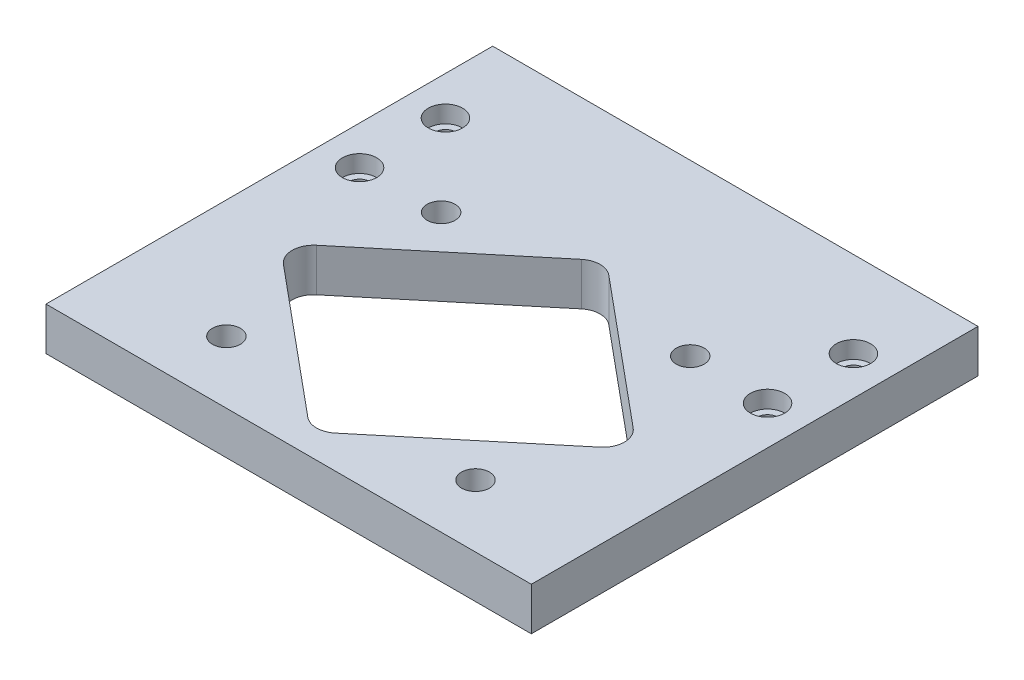
ISO-10303-21;
HEADER;
FILE_DESCRIPTION(('STEP AP214'),'2;1');
FILE_NAME('part.step','',(''),(''),'','','');
FILE_SCHEMA(('AUTOMOTIVE_DESIGN { 1 0 10303 214 1 1 1 1 }'));
ENDSEC;
DATA;
#1=APPLICATION_CONTEXT('core data for automotive mechanical design processes');
#2=APPLICATION_PROTOCOL_DEFINITION('international standard','automotive_design',2000,#1);
#3=PRODUCT_CONTEXT('',#1,'mechanical');
#4=PRODUCT('Part','Part','',(#3));
#5=PRODUCT_RELATED_PRODUCT_CATEGORY('part','',(#4));
#6=PRODUCT_DEFINITION_FORMATION('','',#4);
#7=PRODUCT_DEFINITION_CONTEXT('part definition',#1,'design');
#8=PRODUCT_DEFINITION('design','',#6,#7);
#9=PRODUCT_DEFINITION_SHAPE('','',#8);
#10=(LENGTH_UNIT() NAMED_UNIT(*) SI_UNIT(.MILLI.,.METRE.));
#11=(NAMED_UNIT(*) PLANE_ANGLE_UNIT() SI_UNIT($,.RADIAN.));
#12=(NAMED_UNIT(*) SI_UNIT($,.STERADIAN.) SOLID_ANGLE_UNIT());
#13=UNCERTAINTY_MEASURE_WITH_UNIT(LENGTH_MEASURE(1.E-05),#10,'distance_accuracy_value','');
#14=(GEOMETRIC_REPRESENTATION_CONTEXT(3) GLOBAL_UNCERTAINTY_ASSIGNED_CONTEXT((#13)) GLOBAL_UNIT_ASSIGNED_CONTEXT((#10,
#11,#12)) REPRESENTATION_CONTEXT('',''));
#15=CARTESIAN_POINT('',(0.,0.,0.));
#16=DIRECTION('',(0.,0.,1.));
#17=DIRECTION('',(1.,0.,0.));
#18=AXIS2_PLACEMENT_3D('',#15,#16,#17);
#19=CARTESIAN_POINT('',(0.,10.,0.));
#20=DIRECTION('',(0.,-1.,0.));
#21=DIRECTION('',(0.,0.,-1.));
#22=AXIS2_PLACEMENT_3D('',#19,#20,#21);
#23=PLANE('',#22);
#24=CARTESIAN_POINT('',(-47.5,10.,-44.5));
#25=DIRECTION('',(0.,1.,0.));
#26=DIRECTION('',(0.,0.,1.));
#27=AXIS2_PLACEMENT_3D('',#24,#25,#26);
#28=CIRCLE('',#27,4.);
#29=CARTESIAN_POINT('',(-47.5,10.,-40.5));
#30=VERTEX_POINT('',#29);
#31=EDGE_CURVE('E419',#30,#30,#28,.T.);
#32=ORIENTED_EDGE('',*,*,#31,.F.);
#33=EDGE_LOOP('',(#32));
#34=FACE_BOUND('',#33,.T.);
#35=DIRECTION('',(-0.768980150656052,0.,0.639272655364669));
#36=VECTOR('',#35,1.);
#37=CARTESIAN_POINT('',(0.,10.,-34.5));
#38=LINE('',#37,#36);
#39=CARTESIAN_POINT('',(-3.19636327682333,10.,-31.8427823361348));
#40=VERTEX_POINT('',#39);
#41=CARTESIAN_POINT('',(-36.8749744561991,10.,-3.84490075328026));
#42=VERTEX_POINT('',#41);
#43=EDGE_CURVE('E224',#40,#42,#38,.T.);
#44=ORIENTED_EDGE('',*,*,#43,.F.);
#45=CARTESIAN_POINT('',(0.,10.,-27.9978815828545));
#46=DIRECTION('',(0.,-1.,0.));
#47=DIRECTION('',(0.,0.,-1.));
#48=AXIS2_PLACEMENT_3D('',#45,#46,#47);
#49=CIRCLE('',#48,5.);
#50=CARTESIAN_POINT('',(3.19636327682336,10.,-31.8427823361348));
#51=VERTEX_POINT('',#50);
#52=EDGE_CURVE('E190',#40,#51,#49,.T.);
#53=ORIENTED_EDGE('',*,*,#52,.T.);
#54=DIRECTION('',(-0.768980150656052,0.,-0.639272655364669));
#55=VECTOR('',#54,1.);
#56=CARTESIAN_POINT('',(0.,10.,-34.5));
#57=LINE('',#56,#55);
#58=CARTESIAN_POINT('',(36.8749744561991,10.,-3.84490075328027));
#59=VERTEX_POINT('',#58);
#60=EDGE_CURVE('E242',#59,#51,#57,.T.);
#61=ORIENTED_EDGE('',*,*,#60,.F.);
#62=CARTESIAN_POINT('',(33.6786111793758,10.,0.));
#63=DIRECTION('',(0.,-1.,0.));
#64=DIRECTION('',(0.,0.,-1.));
#65=AXIS2_PLACEMENT_3D('',#62,#63,#64);
#66=CIRCLE('',#65,5.);
#67=CARTESIAN_POINT('',(36.8749744561991,10.,3.84490075328027));
#68=VERTEX_POINT('',#67);
#69=EDGE_CURVE('E202',#59,#68,#66,.T.);
#70=ORIENTED_EDGE('',*,*,#69,.T.);
#71=DIRECTION('',(0.768980150656052,0.,-0.639272655364669));
#72=VECTOR('',#71,1.);
#73=CARTESIAN_POINT('',(41.5,10.,0.));
#74=LINE('',#73,#72);
#75=CARTESIAN_POINT('',(3.19636327682335,10.,31.8427823361348));
#76=VERTEX_POINT('',#75);
#77=EDGE_CURVE('E215',#76,#68,#74,.T.);
#78=ORIENTED_EDGE('',*,*,#77,.F.);
#79=CARTESIAN_POINT('',(0.,10.,27.9978815828545));
#80=DIRECTION('',(0.,-1.,0.));
#81=DIRECTION('',(0.,0.,-1.));
#82=AXIS2_PLACEMENT_3D('',#79,#80,#81);
#83=CIRCLE('',#82,5.);
#84=CARTESIAN_POINT('',(-3.19636327682336,10.,31.8427823361348));
#85=VERTEX_POINT('',#84);
#86=EDGE_CURVE('E48',#76,#85,#83,.T.);
#87=ORIENTED_EDGE('',*,*,#86,.T.);
#88=DIRECTION('',(0.768980150656052,0.,0.639272655364669));
#89=VECTOR('',#88,1.);
#90=CARTESIAN_POINT('',(-41.5,10.,0.));
#91=LINE('',#90,#89);
#92=CARTESIAN_POINT('',(-36.8749744561991,10.,3.84490075328026));
#93=VERTEX_POINT('',#92);
#94=EDGE_CURVE('E214',#93,#85,#91,.T.);
#95=ORIENTED_EDGE('',*,*,#94,.F.);
#96=CARTESIAN_POINT('',(-33.6786111793758,10.,0.));
#97=DIRECTION('',(0.,-1.,0.));
#98=DIRECTION('',(0.,0.,-1.));
#99=AXIS2_PLACEMENT_3D('',#96,#97,#98);
#100=CIRCLE('',#99,5.);
#101=EDGE_CURVE('E196',#93,#42,#100,.T.);
#102=ORIENTED_EDGE('',*,*,#101,.T.);
#103=EDGE_LOOP('',(#44,#53,#61,#70,#78,#87,#95,#102));
#104=FACE_BOUND('',#103,.T.);
#105=CARTESIAN_POINT('',(29.,10.,25.));
#106=DIRECTION('',(0.,-1.,0.));
#107=DIRECTION('',(0.,0.,-1.));
#108=AXIS2_PLACEMENT_3D('',#105,#106,#107);
#109=CIRCLE('',#108,3.25);
#110=CARTESIAN_POINT('',(29.,10.,21.75));
#111=VERTEX_POINT('',#110);
#112=EDGE_CURVE('E236',#111,#111,#109,.T.);
#113=ORIENTED_EDGE('',*,*,#112,.T.);
#114=EDGE_LOOP('',(#113));
#115=FACE_BOUND('',#114,.T.);
#116=CARTESIAN_POINT('',(29.,10.,-25.));
#117=DIRECTION('',(0.,-1.,0.));
#118=DIRECTION('',(0.,0.,-1.));
#119=AXIS2_PLACEMENT_3D('',#116,#117,#118);
#120=CIRCLE('',#119,3.25);
#121=CARTESIAN_POINT('',(29.,10.,-28.25));
#122=VERTEX_POINT('',#121);
#123=EDGE_CURVE('E262',#122,#122,#120,.T.);
#124=ORIENTED_EDGE('',*,*,#123,.T.);
#125=EDGE_LOOP('',(#124));
#126=FACE_BOUND('',#125,.T.);
#127=CARTESIAN_POINT('',(-29.,10.,-25.));
#128=DIRECTION('',(0.,-1.,0.));
#129=DIRECTION('',(0.,0.,-1.));
#130=AXIS2_PLACEMENT_3D('',#127,#128,#129);
#131=CIRCLE('',#130,3.25);
#132=CARTESIAN_POINT('',(-29.,10.,-28.25));
#133=VERTEX_POINT('',#132);
#134=EDGE_CURVE('E253',#133,#133,#131,.T.);
#135=ORIENTED_EDGE('',*,*,#134,.T.);
#136=EDGE_LOOP('',(#135));
#137=FACE_BOUND('',#136,.T.);
#138=CARTESIAN_POINT('',(-29.,10.,25.));
#139=DIRECTION('',(0.,-1.,0.));
#140=DIRECTION('',(0.,0.,-1.));
#141=AXIS2_PLACEMENT_3D('',#138,#139,#140);
#142=CIRCLE('',#141,3.25);
#143=CARTESIAN_POINT('',(-29.,10.,21.75));
#144=VERTEX_POINT('',#143);
#145=EDGE_CURVE('E273',#144,#144,#142,.T.);
#146=ORIENTED_EDGE('',*,*,#145,.T.);
#147=EDGE_LOOP('',(#146));
#148=FACE_BOUND('',#147,.T.);
#149=DIRECTION('',(0.,0.,-1.));
#150=VECTOR('',#149,1.);
#151=CARTESIAN_POINT('',(56.5,10.,39.5));
#152=LINE('',#151,#150);
#153=CARTESIAN_POINT('',(56.5,10.,39.5));
#154=VERTEX_POINT('',#153);
#155=CARTESIAN_POINT('',(56.5,10.,-64.5));
#156=VERTEX_POINT('',#155);
#157=EDGE_CURVE('E141',#154,#156,#152,.T.);
#158=ORIENTED_EDGE('',*,*,#157,.T.);
#159=DIRECTION('',(-1.,0.,0.));
#160=VECTOR('',#159,1.);
#161=CARTESIAN_POINT('',(-56.5,10.,-64.5));
#162=LINE('',#161,#160);
#163=CARTESIAN_POINT('',(-56.5,10.,-64.5));
#164=VERTEX_POINT('',#163);
#165=EDGE_CURVE('E129',#156,#164,#162,.T.);
#166=ORIENTED_EDGE('',*,*,#165,.T.);
#167=DIRECTION('',(0.,0.,1.));
#168=VECTOR('',#167,1.);
#169=CARTESIAN_POINT('',(-56.5,10.,39.5));
#170=LINE('',#169,#168);
#171=CARTESIAN_POINT('',(-56.5,10.,39.5));
#172=VERTEX_POINT('',#171);
#173=EDGE_CURVE('E140',#164,#172,#170,.T.);
#174=ORIENTED_EDGE('',*,*,#173,.T.);
#175=DIRECTION('',(1.,0.,0.));
#176=VECTOR('',#175,1.);
#177=CARTESIAN_POINT('',(-56.5,10.,39.5));
#178=LINE('',#177,#176);
#179=EDGE_CURVE('E146',#172,#154,#178,.T.);
#180=ORIENTED_EDGE('',*,*,#179,.T.);
#181=EDGE_LOOP('',(#158,#166,#174,#180));
#182=FACE_BOUND('',#181,.T.);
#183=CARTESIAN_POINT('',(-47.5,10.,-24.5));
#184=DIRECTION('',(0.,1.,0.));
#185=DIRECTION('',(0.,0.,1.));
#186=AXIS2_PLACEMENT_3D('',#183,#184,#185);
#187=CIRCLE('',#186,3.99999999999999);
#188=CARTESIAN_POINT('',(-47.5,10.,-20.5));
#189=VERTEX_POINT('',#188);
#190=EDGE_CURVE('E433',#189,#189,#187,.T.);
#191=ORIENTED_EDGE('',*,*,#190,.F.);
#192=EDGE_LOOP('',(#191));
#193=FACE_BOUND('',#192,.T.);
#194=CARTESIAN_POINT('',(47.5,10.,-24.5));
#195=DIRECTION('',(0.,1.,0.));
#196=DIRECTION('',(0.,0.,1.));
#197=AXIS2_PLACEMENT_3D('',#194,#195,#196);
#198=CIRCLE('',#197,3.99999999999999);
#199=CARTESIAN_POINT('',(47.5,10.,-20.5));
#200=VERTEX_POINT('',#199);
#201=EDGE_CURVE('E447',#200,#200,#198,.T.);
#202=ORIENTED_EDGE('',*,*,#201,.F.);
#203=EDGE_LOOP('',(#202));
#204=FACE_BOUND('',#203,.T.);
#205=CARTESIAN_POINT('',(47.5,10.,-44.5));
#206=DIRECTION('',(0.,1.,0.));
#207=DIRECTION('',(0.,0.,1.));
#208=AXIS2_PLACEMENT_3D('',#205,#206,#207);
#209=CIRCLE('',#208,4.);
#210=CARTESIAN_POINT('',(47.5,10.,-40.5));
#211=VERTEX_POINT('',#210);
#212=EDGE_CURVE('E461',#211,#211,#209,.T.);
#213=ORIENTED_EDGE('',*,*,#212,.F.);
#214=EDGE_LOOP('',(#213));
#215=FACE_BOUND('',#214,.T.);
#216=ADVANCED_FACE('F39',(#34,#104,#115,#126,#137,#148,#182,#193,#204,#215),#23,.F.);
#217=CARTESIAN_POINT('',(56.5,10.,39.5));
#218=DIRECTION('',(-1.,0.,0.));
#219=DIRECTION('',(0.,0.,1.));
#220=AXIS2_PLACEMENT_3D('',#217,#218,#219);
#221=PLANE('',#220);
#222=DIRECTION('',(0.,0.,-1.));
#223=VECTOR('',#222,1.);
#224=CARTESIAN_POINT('',(56.5,0.,39.5));
#225=LINE('',#224,#223);
#226=CARTESIAN_POINT('',(56.5,0.,39.5));
#227=VERTEX_POINT('',#226);
#228=CARTESIAN_POINT('',(56.5,0.,-64.5));
#229=VERTEX_POINT('',#228);
#230=EDGE_CURVE('E155',#227,#229,#225,.T.);
#231=ORIENTED_EDGE('',*,*,#230,.T.);
#232=DIRECTION('',(0.,-1.,0.));
#233=VECTOR('',#232,1.);
#234=CARTESIAN_POINT('',(56.5,10.,-64.5));
#235=LINE('',#234,#233);
#236=EDGE_CURVE('E133',#156,#229,#235,.T.);
#237=ORIENTED_EDGE('',*,*,#236,.F.);
#238=ORIENTED_EDGE('',*,*,#157,.F.);
#239=DIRECTION('',(0.,-1.,0.));
#240=VECTOR('',#239,1.);
#241=CARTESIAN_POINT('',(56.5,10.,39.5));
#242=LINE('',#241,#240);
#243=EDGE_CURVE('E284',#154,#227,#242,.T.);
#244=ORIENTED_EDGE('',*,*,#243,.T.);
#245=EDGE_LOOP('',(#231,#237,#238,#244));
#246=FACE_BOUND('',#245,.T.);
#247=ADVANCED_FACE('F153',(#246),#221,.F.);
#248=CARTESIAN_POINT('',(-56.5,10.,-64.5));
#249=DIRECTION('',(0.,0.,1.));
#250=DIRECTION('',(1.,0.,0.));
#251=AXIS2_PLACEMENT_3D('',#248,#249,#250);
#252=PLANE('',#251);
#253=DIRECTION('',(-1.,0.,0.));
#254=VECTOR('',#253,1.);
#255=CARTESIAN_POINT('',(-56.5,0.,-64.5));
#256=LINE('',#255,#254);
#257=CARTESIAN_POINT('',(-56.5,0.,-64.5));
#258=VERTEX_POINT('',#257);
#259=EDGE_CURVE('E287',#229,#258,#256,.T.);
#260=ORIENTED_EDGE('',*,*,#259,.T.);
#261=DIRECTION('',(0.,-1.,0.));
#262=VECTOR('',#261,1.);
#263=CARTESIAN_POINT('',(-56.5,10.,-64.5));
#264=LINE('',#263,#262);
#265=EDGE_CURVE('E136',#164,#258,#264,.T.);
#266=ORIENTED_EDGE('',*,*,#265,.F.);
#267=ORIENTED_EDGE('',*,*,#165,.F.);
#268=ORIENTED_EDGE('',*,*,#236,.T.);
#269=EDGE_LOOP('',(#260,#266,#267,#268));
#270=FACE_BOUND('',#269,.T.);
#271=ADVANCED_FACE('F131',(#270),#252,.F.);
#272=CARTESIAN_POINT('',(-56.5,10.,39.5));
#273=DIRECTION('',(1.,0.,0.));
#274=DIRECTION('',(0.,0.,-1.));
#275=AXIS2_PLACEMENT_3D('',#272,#273,#274);
#276=PLANE('',#275);
#277=DIRECTION('',(0.,0.,1.));
#278=VECTOR('',#277,1.);
#279=CARTESIAN_POINT('',(-56.5,0.,39.5));
#280=LINE('',#279,#278);
#281=CARTESIAN_POINT('',(-56.5,0.,39.5));
#282=VERTEX_POINT('',#281);
#283=EDGE_CURVE('E290',#258,#282,#280,.T.);
#284=ORIENTED_EDGE('',*,*,#283,.T.);
#285=DIRECTION('',(0.,-1.,0.));
#286=VECTOR('',#285,1.);
#287=CARTESIAN_POINT('',(-56.5,10.,39.5));
#288=LINE('',#287,#286);
#289=EDGE_CURVE('E163',#172,#282,#288,.T.);
#290=ORIENTED_EDGE('',*,*,#289,.F.);
#291=ORIENTED_EDGE('',*,*,#173,.F.);
#292=ORIENTED_EDGE('',*,*,#265,.T.);
#293=EDGE_LOOP('',(#284,#290,#291,#292));
#294=FACE_BOUND('',#293,.T.);
#295=ADVANCED_FACE('F306',(#294),#276,.F.);
#296=CARTESIAN_POINT('',(-56.5,10.,39.5));
#297=DIRECTION('',(0.,0.,-1.));
#298=DIRECTION('',(-1.,0.,0.));
#299=AXIS2_PLACEMENT_3D('',#296,#297,#298);
#300=PLANE('',#299);
#301=DIRECTION('',(1.,0.,0.));
#302=VECTOR('',#301,1.);
#303=CARTESIAN_POINT('',(-56.5,0.,39.5));
#304=LINE('',#303,#302);
#305=EDGE_CURVE('E151',#282,#227,#304,.T.);
#306=ORIENTED_EDGE('',*,*,#305,.T.);
#307=ORIENTED_EDGE('',*,*,#243,.F.);
#308=ORIENTED_EDGE('',*,*,#179,.F.);
#309=ORIENTED_EDGE('',*,*,#289,.T.);
#310=EDGE_LOOP('',(#306,#307,#308,#309));
#311=FACE_BOUND('',#310,.T.);
#312=ADVANCED_FACE('F301',(#311),#300,.F.);
#313=CARTESIAN_POINT('',(0.,0.,0.));
#314=DIRECTION('',(0.,-1.,0.));
#315=DIRECTION('',(0.,0.,-1.));
#316=AXIS2_PLACEMENT_3D('',#313,#314,#315);
#317=PLANE('',#316);
#318=CARTESIAN_POINT('',(47.5,0.,-44.5));
#319=DIRECTION('',(0.,-1.,0.));
#320=DIRECTION('',(0.,0.,-1.));
#321=AXIS2_PLACEMENT_3D('',#318,#319,#320);
#322=CIRCLE('',#321,2.40000000000001);
#323=CARTESIAN_POINT('',(47.5,0.,-46.9));
#324=VERTEX_POINT('',#323);
#325=EDGE_CURVE('E337',#324,#324,#322,.T.);
#326=ORIENTED_EDGE('',*,*,#325,.F.);
#327=EDGE_LOOP('',(#326));
#328=FACE_BOUND('',#327,.T.);
#329=CARTESIAN_POINT('',(47.5,0.,-24.5));
#330=DIRECTION('',(0.,-1.,0.));
#331=DIRECTION('',(0.,0.,-1.));
#332=AXIS2_PLACEMENT_3D('',#329,#330,#331);
#333=CIRCLE('',#332,2.40000000000001);
#334=CARTESIAN_POINT('',(47.5,0.,-26.9));
#335=VERTEX_POINT('',#334);
#336=EDGE_CURVE('E341',#335,#335,#333,.T.);
#337=ORIENTED_EDGE('',*,*,#336,.F.);
#338=EDGE_LOOP('',(#337));
#339=FACE_BOUND('',#338,.T.);
#340=CARTESIAN_POINT('',(-47.5,0.,-24.5));
#341=DIRECTION('',(0.,-1.,0.));
#342=DIRECTION('',(0.,0.,-1.));
#343=AXIS2_PLACEMENT_3D('',#340,#341,#342);
#344=CIRCLE('',#343,2.40000000000001);
#345=CARTESIAN_POINT('',(-47.5,0.,-26.9));
#346=VERTEX_POINT('',#345);
#347=EDGE_CURVE('E345',#346,#346,#344,.T.);
#348=ORIENTED_EDGE('',*,*,#347,.F.);
#349=EDGE_LOOP('',(#348));
#350=FACE_BOUND('',#349,.T.);
#351=CARTESIAN_POINT('',(-47.5,0.,-44.5));
#352=DIRECTION('',(0.,-1.,0.));
#353=DIRECTION('',(0.,0.,-1.));
#354=AXIS2_PLACEMENT_3D('',#351,#352,#353);
#355=CIRCLE('',#354,2.40000000000001);
#356=CARTESIAN_POINT('',(-47.5,0.,-46.9));
#357=VERTEX_POINT('',#356);
#358=EDGE_CURVE('E246',#357,#357,#355,.T.);
#359=ORIENTED_EDGE('',*,*,#358,.F.);
#360=EDGE_LOOP('',(#359));
#361=FACE_BOUND('',#360,.T.);
#362=DIRECTION('',(0.768980150656052,0.,-0.639272655364669));
#363=VECTOR('',#362,1.);
#364=CARTESIAN_POINT('',(41.5,0.,0.));
#365=LINE('',#364,#363);
#366=CARTESIAN_POINT('',(3.19636327682335,0.,31.8427823361348));
#367=VERTEX_POINT('',#366);
#368=CARTESIAN_POINT('',(36.8749744561991,0.,3.84490075328027));
#369=VERTEX_POINT('',#368);
#370=EDGE_CURVE('E227',#367,#369,#365,.T.);
#371=ORIENTED_EDGE('',*,*,#370,.T.);
#372=CARTESIAN_POINT('',(33.6786111793758,0.,0.));
#373=DIRECTION('',(0.,-1.,0.));
#374=DIRECTION('',(0.,0.,-1.));
#375=AXIS2_PLACEMENT_3D('',#372,#373,#374);
#376=CIRCLE('',#375,5.);
#377=CARTESIAN_POINT('',(36.8749744561991,0.,-3.84490075328027));
#378=VERTEX_POINT('',#377);
#379=EDGE_CURVE('E205',#369,#378,#376,.F.);
#380=ORIENTED_EDGE('',*,*,#379,.T.);
#381=DIRECTION('',(-0.768980150656052,0.,-0.639272655364669));
#382=VECTOR('',#381,1.);
#383=CARTESIAN_POINT('',(0.,0.,-34.5));
#384=LINE('',#383,#382);
#385=CARTESIAN_POINT('',(3.19636327682336,0.,-31.8427823361348));
#386=VERTEX_POINT('',#385);
#387=EDGE_CURVE('E252',#378,#386,#384,.T.);
#388=ORIENTED_EDGE('',*,*,#387,.T.);
#389=CARTESIAN_POINT('',(0.,0.,-27.9978815828545));
#390=DIRECTION('',(0.,-1.,0.));
#391=DIRECTION('',(0.,0.,-1.));
#392=AXIS2_PLACEMENT_3D('',#389,#390,#391);
#393=CIRCLE('',#392,5.);
#394=CARTESIAN_POINT('',(-3.19636327682333,0.,-31.8427823361348));
#395=VERTEX_POINT('',#394);
#396=EDGE_CURVE('E193',#386,#395,#393,.F.);
#397=ORIENTED_EDGE('',*,*,#396,.T.);
#398=DIRECTION('',(-0.768980150656052,0.,0.639272655364669));
#399=VECTOR('',#398,1.);
#400=CARTESIAN_POINT('',(0.,0.,-34.5));
#401=LINE('',#400,#399);
#402=CARTESIAN_POINT('',(-36.8749744561991,0.,-3.84490075328026));
#403=VERTEX_POINT('',#402);
#404=EDGE_CURVE('E238',#395,#403,#401,.T.);
#405=ORIENTED_EDGE('',*,*,#404,.T.);
#406=CARTESIAN_POINT('',(-33.6786111793758,0.,0.));
#407=DIRECTION('',(0.,-1.,0.));
#408=DIRECTION('',(0.,0.,-1.));
#409=AXIS2_PLACEMENT_3D('',#406,#407,#408);
#410=CIRCLE('',#409,5.);
#411=CARTESIAN_POINT('',(-36.8749744561991,0.,3.84490075328026));
#412=VERTEX_POINT('',#411);
#413=EDGE_CURVE('E199',#403,#412,#410,.F.);
#414=ORIENTED_EDGE('',*,*,#413,.T.);
#415=DIRECTION('',(0.768980150656052,0.,0.639272655364669));
#416=VECTOR('',#415,1.);
#417=CARTESIAN_POINT('',(-41.5,0.,0.));
#418=LINE('',#417,#416);
#419=CARTESIAN_POINT('',(-3.19636327682336,0.,31.8427823361348));
#420=VERTEX_POINT('',#419);
#421=EDGE_CURVE('E231',#412,#420,#418,.T.);
#422=ORIENTED_EDGE('',*,*,#421,.T.);
#423=CARTESIAN_POINT('',(0.,0.,27.9978815828545));
#424=DIRECTION('',(0.,-1.,0.));
#425=DIRECTION('',(0.,0.,-1.));
#426=AXIS2_PLACEMENT_3D('',#423,#424,#425);
#427=CIRCLE('',#426,5.);
#428=EDGE_CURVE('E11',#420,#367,#427,.F.);
#429=ORIENTED_EDGE('',*,*,#428,.T.);
#430=EDGE_LOOP('',(#371,#380,#388,#397,#405,#414,#422,#429));
#431=FACE_BOUND('',#430,.T.);
#432=CARTESIAN_POINT('',(29.,0.,25.));
#433=DIRECTION('',(0.,-1.,0.));
#434=DIRECTION('',(0.,0.,-1.));
#435=AXIS2_PLACEMENT_3D('',#432,#433,#434);
#436=CIRCLE('',#435,3.25);
#437=CARTESIAN_POINT('',(29.,0.,21.75));
#438=VERTEX_POINT('',#437);
#439=EDGE_CURVE('E230',#438,#438,#436,.T.);
#440=ORIENTED_EDGE('',*,*,#439,.F.);
#441=EDGE_LOOP('',(#440));
#442=FACE_BOUND('',#441,.T.);
#443=CARTESIAN_POINT('',(29.,0.,-25.));
#444=DIRECTION('',(0.,-1.,0.));
#445=DIRECTION('',(0.,0.,-1.));
#446=AXIS2_PLACEMENT_3D('',#443,#444,#445);
#447=CIRCLE('',#446,3.25);
#448=CARTESIAN_POINT('',(29.,0.,-28.25));
#449=VERTEX_POINT('',#448);
#450=EDGE_CURVE('E266',#449,#449,#447,.T.);
#451=ORIENTED_EDGE('',*,*,#450,.F.);
#452=EDGE_LOOP('',(#451));
#453=FACE_BOUND('',#452,.T.);
#454=CARTESIAN_POINT('',(-29.,0.,-25.));
#455=DIRECTION('',(0.,-1.,0.));
#456=DIRECTION('',(0.,0.,-1.));
#457=AXIS2_PLACEMENT_3D('',#454,#455,#456);
#458=CIRCLE('',#457,3.25);
#459=CARTESIAN_POINT('',(-29.,0.,-28.25));
#460=VERTEX_POINT('',#459);
#461=EDGE_CURVE('E258',#460,#460,#458,.T.);
#462=ORIENTED_EDGE('',*,*,#461,.F.);
#463=EDGE_LOOP('',(#462));
#464=FACE_BOUND('',#463,.T.);
#465=CARTESIAN_POINT('',(-29.,0.,25.));
#466=DIRECTION('',(0.,-1.,0.));
#467=DIRECTION('',(0.,0.,-1.));
#468=AXIS2_PLACEMENT_3D('',#465,#466,#467);
#469=CIRCLE('',#468,3.25);
#470=CARTESIAN_POINT('',(-29.,0.,21.75));
#471=VERTEX_POINT('',#470);
#472=EDGE_CURVE('E257',#471,#471,#469,.T.);
#473=ORIENTED_EDGE('',*,*,#472,.F.);
#474=EDGE_LOOP('',(#473));
#475=FACE_BOUND('',#474,.T.);
#476=ORIENTED_EDGE('',*,*,#230,.F.);
#477=ORIENTED_EDGE('',*,*,#305,.F.);
#478=ORIENTED_EDGE('',*,*,#283,.F.);
#479=ORIENTED_EDGE('',*,*,#259,.F.);
#480=EDGE_LOOP('',(#476,#477,#478,#479));
#481=FACE_BOUND('',#480,.T.);
#482=ADVANCED_FACE('F305',(#328,#339,#350,#361,#431,#442,#453,#464,#475,#481),#317,.T.);
#483=CARTESIAN_POINT('',(-29.,10.,25.));
#484=DIRECTION('',(0.,-1.,0.));
#485=DIRECTION('',(0.,0.,-1.));
#486=AXIS2_PLACEMENT_3D('',#483,#484,#485);
#487=CYLINDRICAL_SURFACE('',#486,3.25);
#488=ORIENTED_EDGE('',*,*,#145,.F.);
#489=EDGE_LOOP('',(#488));
#490=FACE_BOUND('',#489,.T.);
#491=ORIENTED_EDGE('',*,*,#472,.T.);
#492=EDGE_LOOP('',(#491));
#493=FACE_BOUND('',#492,.T.);
#494=ADVANCED_FACE('F325',(#490,#493),#487,.F.);
#495=CARTESIAN_POINT('',(-29.,10.,-25.));
#496=DIRECTION('',(0.,-1.,0.));
#497=DIRECTION('',(0.,0.,-1.));
#498=AXIS2_PLACEMENT_3D('',#495,#496,#497);
#499=CYLINDRICAL_SURFACE('',#498,3.25);
#500=ORIENTED_EDGE('',*,*,#134,.F.);
#501=EDGE_LOOP('',(#500));
#502=FACE_BOUND('',#501,.T.);
#503=ORIENTED_EDGE('',*,*,#461,.T.);
#504=EDGE_LOOP('',(#503));
#505=FACE_BOUND('',#504,.T.);
#506=ADVANCED_FACE('F332',(#502,#505),#499,.F.);
#507=CARTESIAN_POINT('',(29.,10.,-25.));
#508=DIRECTION('',(0.,-1.,0.));
#509=DIRECTION('',(0.,0.,-1.));
#510=AXIS2_PLACEMENT_3D('',#507,#508,#509);
#511=CYLINDRICAL_SURFACE('',#510,3.25);
#512=ORIENTED_EDGE('',*,*,#123,.F.);
#513=EDGE_LOOP('',(#512));
#514=FACE_BOUND('',#513,.T.);
#515=ORIENTED_EDGE('',*,*,#450,.T.);
#516=EDGE_LOOP('',(#515));
#517=FACE_BOUND('',#516,.T.);
#518=ADVANCED_FACE('F359',(#514,#517),#511,.F.);
#519=CARTESIAN_POINT('',(29.,10.,25.));
#520=DIRECTION('',(0.,-1.,0.));
#521=DIRECTION('',(0.,0.,-1.));
#522=AXIS2_PLACEMENT_3D('',#519,#520,#521);
#523=CYLINDRICAL_SURFACE('',#522,3.25);
#524=ORIENTED_EDGE('',*,*,#112,.F.);
#525=EDGE_LOOP('',(#524));
#526=FACE_BOUND('',#525,.T.);
#527=ORIENTED_EDGE('',*,*,#439,.T.);
#528=EDGE_LOOP('',(#527));
#529=FACE_BOUND('',#528,.T.);
#530=ADVANCED_FACE('F365',(#526,#529),#523,.F.);
#531=CARTESIAN_POINT('',(0.,0.,-34.5));
#532=DIRECTION('',(0.63927265536467,0.,-0.768980150656052));
#533=DIRECTION('',(-0.768980150656052,0.,-0.63927265536467));
#534=AXIS2_PLACEMENT_3D('',#531,#532,#533);
#535=PLANE('',#534);
#536=ORIENTED_EDGE('',*,*,#60,.T.);
#537=DIRECTION('',(0.,1.,0.));
#538=VECTOR('',#537,1.);
#539=CARTESIAN_POINT('',(3.19636327682336,0.,-31.8427823361348));
#540=LINE('',#539,#538);
#541=EDGE_CURVE('E174',#51,#386,#540,.F.);
#542=ORIENTED_EDGE('',*,*,#541,.T.);
#543=ORIENTED_EDGE('',*,*,#387,.F.);
#544=DIRECTION('',(0.,1.,0.));
#545=VECTOR('',#544,1.);
#546=CARTESIAN_POINT('',(36.8749744561991,10.,-3.84490075328026));
#547=LINE('',#546,#545);
#548=EDGE_CURVE('E170',#378,#59,#547,.T.);
#549=ORIENTED_EDGE('',*,*,#548,.T.);
#550=EDGE_LOOP('',(#536,#542,#543,#549));
#551=FACE_BOUND('',#550,.T.);
#552=ADVANCED_FACE('F370',(#551),#535,.F.);
#553=CARTESIAN_POINT('',(41.5,0.,0.));
#554=DIRECTION('',(0.639272655364669,0.,0.768980150656052));
#555=DIRECTION('',(0.768980150656052,0.,-0.639272655364669));
#556=AXIS2_PLACEMENT_3D('',#553,#554,#555);
#557=PLANE('',#556);
#558=ORIENTED_EDGE('',*,*,#77,.T.);
#559=DIRECTION('',(0.,1.,0.));
#560=VECTOR('',#559,1.);
#561=CARTESIAN_POINT('',(36.8749744561991,0.,3.84490075328027));
#562=LINE('',#561,#560);
#563=EDGE_CURVE('E55',#68,#369,#562,.F.);
#564=ORIENTED_EDGE('',*,*,#563,.T.);
#565=ORIENTED_EDGE('',*,*,#370,.F.);
#566=DIRECTION('',(0.,1.,0.));
#567=VECTOR('',#566,1.);
#568=CARTESIAN_POINT('',(3.19636327682335,10.,31.8427823361348));
#569=LINE('',#568,#567);
#570=EDGE_CURVE('E184',#367,#76,#569,.T.);
#571=ORIENTED_EDGE('',*,*,#570,.T.);
#572=EDGE_LOOP('',(#558,#564,#565,#571));
#573=FACE_BOUND('',#572,.T.);
#574=ADVANCED_FACE('F226',(#573),#557,.F.);
#575=CARTESIAN_POINT('',(-41.5,0.,0.));
#576=DIRECTION('',(-0.63927265536467,0.,0.768980150656052));
#577=DIRECTION('',(0.768980150656052,0.,0.63927265536467));
#578=AXIS2_PLACEMENT_3D('',#575,#576,#577);
#579=PLANE('',#578);
#580=ORIENTED_EDGE('',*,*,#421,.F.);
#581=DIRECTION('',(0.,1.,0.));
#582=VECTOR('',#581,1.);
#583=CARTESIAN_POINT('',(-36.8749744561991,10.,3.84490075328026));
#584=LINE('',#583,#582);
#585=EDGE_CURVE('E180',#412,#93,#584,.T.);
#586=ORIENTED_EDGE('',*,*,#585,.T.);
#587=ORIENTED_EDGE('',*,*,#94,.T.);
#588=DIRECTION('',(0.,1.,0.));
#589=VECTOR('',#588,1.);
#590=CARTESIAN_POINT('',(-3.19636327682335,0.,31.8427823361348));
#591=LINE('',#590,#589);
#592=EDGE_CURVE('E177',#85,#420,#591,.F.);
#593=ORIENTED_EDGE('',*,*,#592,.T.);
#594=EDGE_LOOP('',(#580,#586,#587,#593));
#595=FACE_BOUND('',#594,.T.);
#596=ADVANCED_FACE('F221',(#595),#579,.F.);
#597=CARTESIAN_POINT('',(0.,0.,-34.5));
#598=DIRECTION('',(-0.639272655364669,0.,-0.768980150656052));
#599=DIRECTION('',(-0.768980150656052,0.,0.639272655364669));
#600=AXIS2_PLACEMENT_3D('',#597,#598,#599);
#601=PLANE('',#600);
#602=ORIENTED_EDGE('',*,*,#404,.F.);
#603=DIRECTION('',(0.,1.,0.));
#604=VECTOR('',#603,1.);
#605=CARTESIAN_POINT('',(-3.19636327682334,10.,-31.8427823361348));
#606=LINE('',#605,#604);
#607=EDGE_CURVE('E161',#395,#40,#606,.T.);
#608=ORIENTED_EDGE('',*,*,#607,.T.);
#609=ORIENTED_EDGE('',*,*,#43,.T.);
#610=DIRECTION('',(0.,1.,0.));
#611=VECTOR('',#610,1.);
#612=CARTESIAN_POINT('',(-36.8749744561991,0.,-3.84490075328025));
#613=LINE('',#612,#611);
#614=EDGE_CURVE('E157',#42,#403,#613,.F.);
#615=ORIENTED_EDGE('',*,*,#614,.T.);
#616=EDGE_LOOP('',(#602,#608,#609,#615));
#617=FACE_BOUND('',#616,.T.);
#618=ADVANCED_FACE('F403',(#617),#601,.F.);
#619=CARTESIAN_POINT('',(0.,0.,-27.9978815828545));
#620=DIRECTION('',(0.,-1.,0.));
#621=DIRECTION('',(0.,0.,-1.));
#622=AXIS2_PLACEMENT_3D('',#619,#620,#621);
#623=CYLINDRICAL_SURFACE('',#622,5.);
#624=ORIENTED_EDGE('',*,*,#396,.F.);
#625=ORIENTED_EDGE('',*,*,#541,.F.);
#626=ORIENTED_EDGE('',*,*,#52,.F.);
#627=ORIENTED_EDGE('',*,*,#607,.F.);
#628=EDGE_LOOP('',(#624,#625,#626,#627));
#629=FACE_BOUND('',#628,.T.);
#630=ADVANCED_FACE('F397',(#629),#623,.F.);
#631=CARTESIAN_POINT('',(-33.6786111793758,0.,0.));
#632=DIRECTION('',(0.,-1.,0.));
#633=DIRECTION('',(0.,0.,-1.));
#634=AXIS2_PLACEMENT_3D('',#631,#632,#633);
#635=CYLINDRICAL_SURFACE('',#634,5.);
#636=ORIENTED_EDGE('',*,*,#413,.F.);
#637=ORIENTED_EDGE('',*,*,#614,.F.);
#638=ORIENTED_EDGE('',*,*,#101,.F.);
#639=ORIENTED_EDGE('',*,*,#585,.F.);
#640=EDGE_LOOP('',(#636,#637,#638,#639));
#641=FACE_BOUND('',#640,.T.);
#642=ADVANCED_FACE('F524',(#641),#635,.F.);
#643=CARTESIAN_POINT('',(33.6786111793758,0.,0.));
#644=DIRECTION('',(0.,-1.,0.));
#645=DIRECTION('',(0.,0.,-1.));
#646=AXIS2_PLACEMENT_3D('',#643,#644,#645);
#647=CYLINDRICAL_SURFACE('',#646,5.);
#648=ORIENTED_EDGE('',*,*,#379,.F.);
#649=ORIENTED_EDGE('',*,*,#563,.F.);
#650=ORIENTED_EDGE('',*,*,#69,.F.);
#651=ORIENTED_EDGE('',*,*,#548,.F.);
#652=EDGE_LOOP('',(#648,#649,#650,#651));
#653=FACE_BOUND('',#652,.T.);
#654=ADVANCED_FACE('F529',(#653),#647,.F.);
#655=CARTESIAN_POINT('',(0.,0.,27.9978815828545));
#656=DIRECTION('',(0.,-1.,0.));
#657=DIRECTION('',(0.,0.,-1.));
#658=AXIS2_PLACEMENT_3D('',#655,#656,#657);
#659=CYLINDRICAL_SURFACE('',#658,5.);
#660=ORIENTED_EDGE('',*,*,#428,.F.);
#661=ORIENTED_EDGE('',*,*,#592,.F.);
#662=ORIENTED_EDGE('',*,*,#86,.F.);
#663=ORIENTED_EDGE('',*,*,#570,.F.);
#664=EDGE_LOOP('',(#660,#661,#662,#663));
#665=FACE_BOUND('',#664,.T.);
#666=ADVANCED_FACE('F41',(#665),#659,.F.);
#667=CARTESIAN_POINT('',(-47.5,10.,-44.5));
#668=DIRECTION('',(0.,1.,0.));
#669=DIRECTION('',(0.,0.,1.));
#670=AXIS2_PLACEMENT_3D('',#667,#668,#669);
#671=CYLINDRICAL_SURFACE('',#670,2.40000000000001);
#672=CARTESIAN_POINT('',(-47.5,6.,-44.5));
#673=DIRECTION('',(0.,1.,0.));
#674=DIRECTION('',(0.,0.,1.));
#675=AXIS2_PLACEMENT_3D('',#672,#673,#674);
#676=CIRCLE('',#675,2.40000000000001);
#677=CARTESIAN_POINT('',(-47.5,6.,-42.1));
#678=VERTEX_POINT('',#677);
#679=EDGE_CURVE('E411',#678,#678,#676,.T.);
#680=ORIENTED_EDGE('',*,*,#679,.T.);
#681=EDGE_LOOP('',(#680));
#682=FACE_BOUND('',#681,.T.);
#683=ORIENTED_EDGE('',*,*,#358,.T.);
#684=EDGE_LOOP('',(#683));
#685=FACE_BOUND('',#684,.T.);
#686=ADVANCED_FACE('F514',(#682,#685),#671,.F.);
#687=CARTESIAN_POINT('',(-45.1,6.,-44.5));
#688=DIRECTION('',(0.,-1.,0.));
#689=DIRECTION('',(0.,0.,-1.));
#690=AXIS2_PLACEMENT_3D('',#687,#688,#689);
#691=PLANE('',#690);
#692=ORIENTED_EDGE('',*,*,#679,.F.);
#693=EDGE_LOOP('',(#692));
#694=FACE_BOUND('',#693,.T.);
#695=CARTESIAN_POINT('',(-47.5,6.,-44.5));
#696=DIRECTION('',(0.,1.,0.));
#697=DIRECTION('',(0.,0.,1.));
#698=AXIS2_PLACEMENT_3D('',#695,#696,#697);
#699=CIRCLE('',#698,4.);
#700=CARTESIAN_POINT('',(-47.5,6.,-40.5));
#701=VERTEX_POINT('',#700);
#702=EDGE_CURVE('E415',#701,#701,#699,.T.);
#703=ORIENTED_EDGE('',*,*,#702,.T.);
#704=EDGE_LOOP('',(#703));
#705=FACE_BOUND('',#704,.T.);
#706=ADVANCED_FACE('F510',(#694,#705),#691,.F.);
#707=CARTESIAN_POINT('',(-47.5,10.,-44.5));
#708=DIRECTION('',(0.,1.,0.));
#709=DIRECTION('',(0.,0.,1.));
#710=AXIS2_PLACEMENT_3D('',#707,#708,#709);
#711=CYLINDRICAL_SURFACE('',#710,4.);
#712=ORIENTED_EDGE('',*,*,#702,.F.);
#713=EDGE_LOOP('',(#712));
#714=FACE_BOUND('',#713,.T.);
#715=ORIENTED_EDGE('',*,*,#31,.T.);
#716=EDGE_LOOP('',(#715));
#717=FACE_BOUND('',#716,.T.);
#718=ADVANCED_FACE('F506',(#714,#717),#711,.F.);
#719=CARTESIAN_POINT('',(-47.5,10.,-24.5));
#720=DIRECTION('',(0.,1.,0.));
#721=DIRECTION('',(0.,0.,1.));
#722=AXIS2_PLACEMENT_3D('',#719,#720,#721);
#723=CYLINDRICAL_SURFACE('',#722,2.40000000000001);
#724=CARTESIAN_POINT('',(-47.5,6.,-24.5));
#725=DIRECTION('',(0.,1.,0.));
#726=DIRECTION('',(0.,0.,1.));
#727=AXIS2_PLACEMENT_3D('',#724,#725,#726);
#728=CIRCLE('',#727,2.40000000000001);
#729=CARTESIAN_POINT('',(-47.5,6.,-22.1));
#730=VERTEX_POINT('',#729);
#731=EDGE_CURVE('E425',#730,#730,#728,.T.);
#732=ORIENTED_EDGE('',*,*,#731,.T.);
#733=EDGE_LOOP('',(#732));
#734=FACE_BOUND('',#733,.T.);
#735=ORIENTED_EDGE('',*,*,#347,.T.);
#736=EDGE_LOOP('',(#735));
#737=FACE_BOUND('',#736,.T.);
#738=ADVANCED_FACE('F502',(#734,#737),#723,.F.);
#739=CARTESIAN_POINT('',(-45.1,6.,-24.5));
#740=DIRECTION('',(0.,-1.,0.));
#741=DIRECTION('',(0.,0.,-1.));
#742=AXIS2_PLACEMENT_3D('',#739,#740,#741);
#743=PLANE('',#742);
#744=ORIENTED_EDGE('',*,*,#731,.F.);
#745=EDGE_LOOP('',(#744));
#746=FACE_BOUND('',#745,.T.);
#747=CARTESIAN_POINT('',(-47.5,6.,-24.5));
#748=DIRECTION('',(0.,1.,0.));
#749=DIRECTION('',(0.,0.,1.));
#750=AXIS2_PLACEMENT_3D('',#747,#748,#749);
#751=CIRCLE('',#750,3.99999999999999);
#752=CARTESIAN_POINT('',(-47.5,6.,-20.5));
#753=VERTEX_POINT('',#752);
#754=EDGE_CURVE('E429',#753,#753,#751,.T.);
#755=ORIENTED_EDGE('',*,*,#754,.T.);
#756=EDGE_LOOP('',(#755));
#757=FACE_BOUND('',#756,.T.);
#758=ADVANCED_FACE('F498',(#746,#757),#743,.F.);
#759=CARTESIAN_POINT('',(-47.5,10.,-24.5));
#760=DIRECTION('',(0.,1.,0.));
#761=DIRECTION('',(0.,0.,1.));
#762=AXIS2_PLACEMENT_3D('',#759,#760,#761);
#763=CYLINDRICAL_SURFACE('',#762,3.99999999999999);
#764=ORIENTED_EDGE('',*,*,#754,.F.);
#765=EDGE_LOOP('',(#764));
#766=FACE_BOUND('',#765,.T.);
#767=ORIENTED_EDGE('',*,*,#190,.T.);
#768=EDGE_LOOP('',(#767));
#769=FACE_BOUND('',#768,.T.);
#770=ADVANCED_FACE('F494',(#766,#769),#763,.F.);
#771=CARTESIAN_POINT('',(47.5,10.,-24.5));
#772=DIRECTION('',(0.,1.,0.));
#773=DIRECTION('',(0.,0.,1.));
#774=AXIS2_PLACEMENT_3D('',#771,#772,#773);
#775=CYLINDRICAL_SURFACE('',#774,2.40000000000001);
#776=CARTESIAN_POINT('',(47.5,6.,-24.5));
#777=DIRECTION('',(0.,1.,0.));
#778=DIRECTION('',(0.,0.,1.));
#779=AXIS2_PLACEMENT_3D('',#776,#777,#778);
#780=CIRCLE('',#779,2.40000000000001);
#781=CARTESIAN_POINT('',(47.5,6.,-22.1));
#782=VERTEX_POINT('',#781);
#783=EDGE_CURVE('E439',#782,#782,#780,.T.);
#784=ORIENTED_EDGE('',*,*,#783,.T.);
#785=EDGE_LOOP('',(#784));
#786=FACE_BOUND('',#785,.T.);
#787=ORIENTED_EDGE('',*,*,#336,.T.);
#788=EDGE_LOOP('',(#787));
#789=FACE_BOUND('',#788,.T.);
#790=ADVANCED_FACE('F490',(#786,#789),#775,.F.);
#791=CARTESIAN_POINT('',(49.9,6.,-24.5));
#792=DIRECTION('',(0.,-1.,0.));
#793=DIRECTION('',(0.,0.,-1.));
#794=AXIS2_PLACEMENT_3D('',#791,#792,#793);
#795=PLANE('',#794);
#796=ORIENTED_EDGE('',*,*,#783,.F.);
#797=EDGE_LOOP('',(#796));
#798=FACE_BOUND('',#797,.T.);
#799=CARTESIAN_POINT('',(47.5,6.,-24.5));
#800=DIRECTION('',(0.,1.,0.));
#801=DIRECTION('',(0.,0.,1.));
#802=AXIS2_PLACEMENT_3D('',#799,#800,#801);
#803=CIRCLE('',#802,3.99999999999999);
#804=CARTESIAN_POINT('',(47.5,6.,-20.5));
#805=VERTEX_POINT('',#804);
#806=EDGE_CURVE('E443',#805,#805,#803,.T.);
#807=ORIENTED_EDGE('',*,*,#806,.T.);
#808=EDGE_LOOP('',(#807));
#809=FACE_BOUND('',#808,.T.);
#810=ADVANCED_FACE('F486',(#798,#809),#795,.F.);
#811=CARTESIAN_POINT('',(47.5,10.,-24.5));
#812=DIRECTION('',(0.,1.,0.));
#813=DIRECTION('',(0.,0.,1.));
#814=AXIS2_PLACEMENT_3D('',#811,#812,#813);
#815=CYLINDRICAL_SURFACE('',#814,3.99999999999999);
#816=ORIENTED_EDGE('',*,*,#806,.F.);
#817=EDGE_LOOP('',(#816));
#818=FACE_BOUND('',#817,.T.);
#819=ORIENTED_EDGE('',*,*,#201,.T.);
#820=EDGE_LOOP('',(#819));
#821=FACE_BOUND('',#820,.T.);
#822=ADVANCED_FACE('F482',(#818,#821),#815,.F.);
#823=CARTESIAN_POINT('',(47.5,10.,-44.5));
#824=DIRECTION('',(0.,1.,0.));
#825=DIRECTION('',(0.,0.,1.));
#826=AXIS2_PLACEMENT_3D('',#823,#824,#825);
#827=CYLINDRICAL_SURFACE('',#826,2.40000000000001);
#828=CARTESIAN_POINT('',(47.5,6.,-44.5));
#829=DIRECTION('',(0.,1.,0.));
#830=DIRECTION('',(0.,0.,1.));
#831=AXIS2_PLACEMENT_3D('',#828,#829,#830);
#832=CIRCLE('',#831,2.40000000000001);
#833=CARTESIAN_POINT('',(47.5,6.,-42.1));
#834=VERTEX_POINT('',#833);
#835=EDGE_CURVE('E453',#834,#834,#832,.T.);
#836=ORIENTED_EDGE('',*,*,#835,.T.);
#837=EDGE_LOOP('',(#836));
#838=FACE_BOUND('',#837,.T.);
#839=ORIENTED_EDGE('',*,*,#325,.T.);
#840=EDGE_LOOP('',(#839));
#841=FACE_BOUND('',#840,.T.);
#842=ADVANCED_FACE('F475',(#838,#841),#827,.F.);
#843=CARTESIAN_POINT('',(49.9,6.,-44.5));
#844=DIRECTION('',(0.,-1.,0.));
#845=DIRECTION('',(0.,0.,-1.));
#846=AXIS2_PLACEMENT_3D('',#843,#844,#845);
#847=PLANE('',#846);
#848=ORIENTED_EDGE('',*,*,#835,.F.);
#849=EDGE_LOOP('',(#848));
#850=FACE_BOUND('',#849,.T.);
#851=CARTESIAN_POINT('',(47.5,6.,-44.5));
#852=DIRECTION('',(0.,1.,0.));
#853=DIRECTION('',(0.,0.,1.));
#854=AXIS2_PLACEMENT_3D('',#851,#852,#853);
#855=CIRCLE('',#854,4.);
#856=CARTESIAN_POINT('',(47.5,6.,-40.5));
#857=VERTEX_POINT('',#856);
#858=EDGE_CURVE('E457',#857,#857,#855,.T.);
#859=ORIENTED_EDGE('',*,*,#858,.T.);
#860=EDGE_LOOP('',(#859));
#861=FACE_BOUND('',#860,.T.);
#862=ADVANCED_FACE('F469',(#850,#861),#847,.F.);
#863=CARTESIAN_POINT('',(47.5,10.,-44.5));
#864=DIRECTION('',(0.,1.,0.));
#865=DIRECTION('',(0.,0.,1.));
#866=AXIS2_PLACEMENT_3D('',#863,#864,#865);
#867=CYLINDRICAL_SURFACE('',#866,4.);
#868=ORIENTED_EDGE('',*,*,#858,.F.);
#869=EDGE_LOOP('',(#868));
#870=FACE_BOUND('',#869,.T.);
#871=ORIENTED_EDGE('',*,*,#212,.T.);
#872=EDGE_LOOP('',(#871));
#873=FACE_BOUND('',#872,.T.);
#874=ADVANCED_FACE('F466',(#870,#873),#867,.F.);
#875=CLOSED_SHELL('',(#216,#247,#271,#295,#312,#482,#494,#506,#518,#530,#552,#574,#596,#618,
#630,#642,#654,#666,#686,#706,#718,#738,#758,#770,#790,#810,#822,#842,#862,#874));
#876=MANIFOLD_SOLID_BREP('B2',#875);
#877=ADVANCED_BREP_SHAPE_REPRESENTATION('',(#18,#876),#14);
#878=SHAPE_DEFINITION_REPRESENTATION(#9,#877);
ENDSEC;
END-ISO-10303-21;
